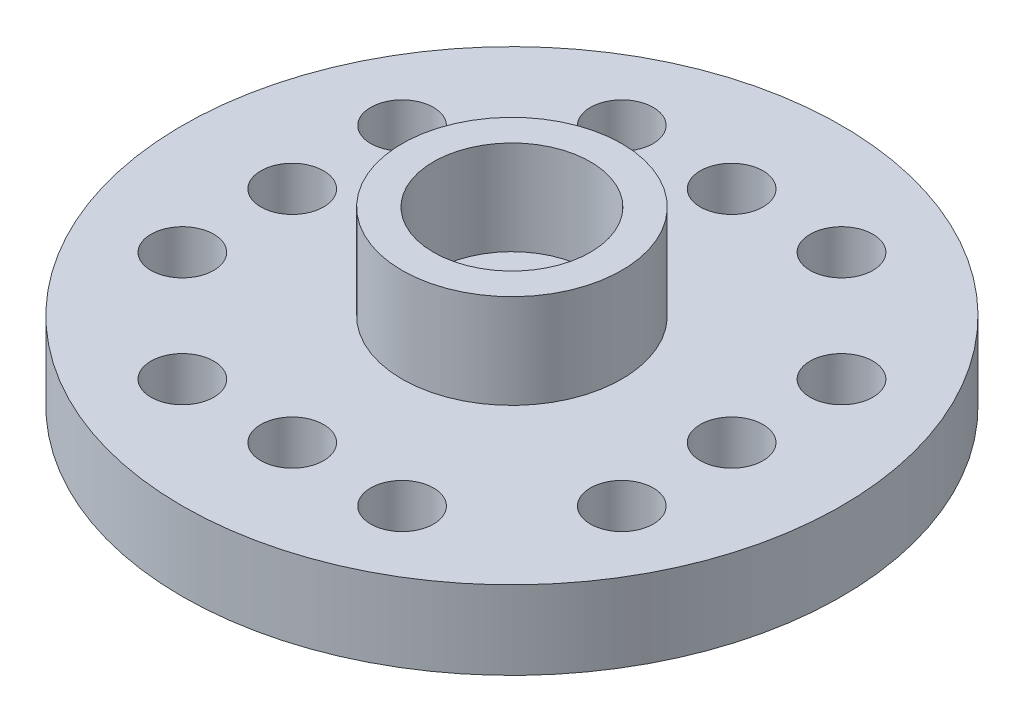
ISO-10303-21;
HEADER;
FILE_DESCRIPTION(('STEP AP214'),'2;1');
FILE_NAME('part.step','',(''),(''),'','','');
FILE_SCHEMA(('AUTOMOTIVE_DESIGN { 1 0 10303 214 1 1 1 1 }'));
ENDSEC;
DATA;
#1=APPLICATION_CONTEXT('core data for automotive mechanical design processes');
#2=APPLICATION_PROTOCOL_DEFINITION('international standard','automotive_design',2000,#1);
#3=PRODUCT_CONTEXT('',#1,'mechanical');
#4=PRODUCT('Part','Part','',(#3));
#5=PRODUCT_RELATED_PRODUCT_CATEGORY('part','',(#4));
#6=PRODUCT_DEFINITION_FORMATION('','',#4);
#7=PRODUCT_DEFINITION_CONTEXT('part definition',#1,'design');
#8=PRODUCT_DEFINITION('design','',#6,#7);
#9=PRODUCT_DEFINITION_SHAPE('','',#8);
#10=(LENGTH_UNIT() NAMED_UNIT(*) SI_UNIT(.MILLI.,.METRE.));
#11=(NAMED_UNIT(*) PLANE_ANGLE_UNIT() SI_UNIT($,.RADIAN.));
#12=(NAMED_UNIT(*) SI_UNIT($,.STERADIAN.) SOLID_ANGLE_UNIT());
#13=UNCERTAINTY_MEASURE_WITH_UNIT(LENGTH_MEASURE(1.E-05),#10,'distance_accuracy_value','');
#14=(GEOMETRIC_REPRESENTATION_CONTEXT(3) GLOBAL_UNCERTAINTY_ASSIGNED_CONTEXT((#13)) GLOBAL_UNIT_ASSIGNED_CONTEXT((#10,
#11,#12)) REPRESENTATION_CONTEXT('',''));
#15=CARTESIAN_POINT('',(0.,0.,0.));
#16=DIRECTION('',(0.,0.,1.));
#17=DIRECTION('',(1.,0.,0.));
#18=AXIS2_PLACEMENT_3D('',#15,#16,#17);
#19=CARTESIAN_POINT('',(0.,-0.5,0.));
#20=DIRECTION('',(0.,1.,0.));
#21=DIRECTION('',(0.,0.,1.));
#22=AXIS2_PLACEMENT_3D('',#19,#20,#21);
#23=CYLINDRICAL_SURFACE('',#22,1.5);
#24=CARTESIAN_POINT('',(0.,2.5,0.));
#25=DIRECTION('',(0.,1.,0.));
#26=DIRECTION('',(0.,0.,1.));
#27=AXIS2_PLACEMENT_3D('',#24,#25,#26);
#28=CIRCLE('',#27,1.5);
#29=CARTESIAN_POINT('',(0.,2.5,1.5));
#30=VERTEX_POINT('',#29);
#31=EDGE_CURVE('E57',#30,#30,#28,.T.);
#32=ORIENTED_EDGE('',*,*,#31,.T.);
#33=EDGE_LOOP('',(#32));
#34=FACE_BOUND('',#33,.T.);
#35=CARTESIAN_POINT('',(0.,1.5,0.));
#36=DIRECTION('',(0.,-1.,0.));
#37=DIRECTION('',(0.,0.,-1.));
#38=AXIS2_PLACEMENT_3D('',#35,#36,#37);
#39=CIRCLE('',#38,1.5);
#40=CARTESIAN_POINT('',(0.,1.5,-1.5));
#41=VERTEX_POINT('',#40);
#42=EDGE_CURVE('E64',#41,#41,#39,.T.);
#43=ORIENTED_EDGE('',*,*,#42,.T.);
#44=EDGE_LOOP('',(#43));
#45=FACE_BOUND('',#44,.T.);
#46=ADVANCED_FACE('F31',(#34,#45),#23,.F.);
#47=CARTESIAN_POINT('',(0.,2.5,0.));
#48=DIRECTION('',(0.,-1.,0.));
#49=DIRECTION('',(0.,0.,-1.));
#50=AXIS2_PLACEMENT_3D('',#47,#48,#49);
#51=CYLINDRICAL_SURFACE('',#50,10.5);
#52=CARTESIAN_POINT('',(0.,2.5,0.));
#53=DIRECTION('',(0.,1.,0.));
#54=DIRECTION('',(0.,0.,1.));
#55=AXIS2_PLACEMENT_3D('',#52,#53,#54);
#56=CIRCLE('',#55,10.5);
#57=CARTESIAN_POINT('',(0.,2.5,10.5));
#58=VERTEX_POINT('',#57);
#59=EDGE_CURVE('E38',#58,#58,#56,.T.);
#60=ORIENTED_EDGE('',*,*,#59,.F.);
#61=EDGE_LOOP('',(#60));
#62=FACE_BOUND('',#61,.T.);
#63=CARTESIAN_POINT('',(0.,0.,0.));
#64=DIRECTION('',(0.,1.,0.));
#65=DIRECTION('',(0.,0.,1.));
#66=AXIS2_PLACEMENT_3D('',#63,#64,#65);
#67=CIRCLE('',#66,10.5);
#68=CARTESIAN_POINT('',(0.,0.,10.5));
#69=VERTEX_POINT('',#68);
#70=EDGE_CURVE('E42',#69,#69,#67,.T.);
#71=ORIENTED_EDGE('',*,*,#70,.T.);
#72=EDGE_LOOP('',(#71));
#73=FACE_BOUND('',#72,.T.);
#74=ADVANCED_FACE('F33',(#62,#73),#51,.T.);
#75=CARTESIAN_POINT('',(0.,2.5,0.));
#76=DIRECTION('',(0.,1.,0.));
#77=DIRECTION('',(0.,0.,1.));
#78=AXIS2_PLACEMENT_3D('',#75,#76,#77);
#79=PLANE('',#78);
#80=CARTESIAN_POINT('',(-6.99999999999931,2.5,-3.5000000000005));
#81=DIRECTION('',(0.,1.,0.));
#82=DIRECTION('',(0.,0.,1.));
#83=AXIS2_PLACEMENT_3D('',#80,#81,#82);
#84=CIRCLE('',#83,1.00000000000076);
#85=CARTESIAN_POINT('',(-6.99999999999931,2.5,-2.49999999999974));
#86=VERTEX_POINT('',#85);
#87=EDGE_CURVE('E69',#86,#86,#84,.T.);
#88=ORIENTED_EDGE('',*,*,#87,.F.);
#89=EDGE_LOOP('',(#88));
#90=FACE_BOUND('',#89,.T.);
#91=CARTESIAN_POINT('',(-6.99999999999931,2.5,3.4999999999995));
#92=DIRECTION('',(0.,1.,0.));
#93=DIRECTION('',(0.,0.,1.));
#94=AXIS2_PLACEMENT_3D('',#91,#92,#93);
#95=CIRCLE('',#94,1.00000000000074);
#96=CARTESIAN_POINT('',(-6.99999999999931,2.5,4.50000000000024));
#97=VERTEX_POINT('',#96);
#98=EDGE_CURVE('E72',#97,#97,#95,.T.);
#99=ORIENTED_EDGE('',*,*,#98,.F.);
#100=EDGE_LOOP('',(#99));
#101=FACE_BOUND('',#100,.T.);
#102=CARTESIAN_POINT('',(-6.99999999999931,2.5,-4.99711383383775E-13));
#103=DIRECTION('',(0.,1.,0.));
#104=DIRECTION('',(0.,0.,1.));
#105=AXIS2_PLACEMENT_3D('',#102,#103,#104);
#106=CIRCLE('',#105,1.00000000000075);
#107=CARTESIAN_POINT('',(-6.99999999999931,2.5,1.00000000000025));
#108=VERTEX_POINT('',#107);
#109=EDGE_CURVE('E75',#108,#108,#106,.T.);
#110=ORIENTED_EDGE('',*,*,#109,.F.);
#111=EDGE_LOOP('',(#110));
#112=FACE_BOUND('',#111,.T.);
#113=CARTESIAN_POINT('',(3.5,2.5,7.));
#114=DIRECTION('',(0.,1.,0.));
#115=DIRECTION('',(0.,0.,1.));
#116=AXIS2_PLACEMENT_3D('',#113,#114,#115);
#117=CIRCLE('',#116,0.999999999999999);
#118=CARTESIAN_POINT('',(3.5,2.5,8.));
#119=VERTEX_POINT('',#118);
#120=EDGE_CURVE('E78',#119,#119,#117,.T.);
#121=ORIENTED_EDGE('',*,*,#120,.F.);
#122=EDGE_LOOP('',(#121));
#123=FACE_BOUND('',#122,.T.);
#124=CARTESIAN_POINT('',(-3.5,2.5,7.));
#125=DIRECTION('',(0.,1.,0.));
#126=DIRECTION('',(0.,0.,1.));
#127=AXIS2_PLACEMENT_3D('',#124,#125,#126);
#128=CIRCLE('',#127,1.);
#129=CARTESIAN_POINT('',(-3.5,2.5,8.));
#130=VERTEX_POINT('',#129);
#131=EDGE_CURVE('E81',#130,#130,#128,.T.);
#132=ORIENTED_EDGE('',*,*,#131,.F.);
#133=EDGE_LOOP('',(#132));
#134=FACE_BOUND('',#133,.T.);
#135=CARTESIAN_POINT('',(7.0000000000005,2.5,6.93143159933774E-13));
#136=DIRECTION('',(0.,1.,0.));
#137=DIRECTION('',(0.,0.,1.));
#138=AXIS2_PLACEMENT_3D('',#135,#136,#137);
#139=CIRCLE('',#138,1.00000000000054);
#140=CARTESIAN_POINT('',(7.0000000000005,2.5,1.00000000000124));
#141=VERTEX_POINT('',#140);
#142=EDGE_CURVE('E84',#141,#141,#139,.T.);
#143=ORIENTED_EDGE('',*,*,#142,.F.);
#144=EDGE_LOOP('',(#143));
#145=FACE_BOUND('',#144,.T.);
#146=CARTESIAN_POINT('',(7.0000000000005,2.5,-3.49999999999931));
#147=DIRECTION('',(0.,1.,0.));
#148=DIRECTION('',(0.,0.,1.));
#149=AXIS2_PLACEMENT_3D('',#146,#147,#148);
#150=CIRCLE('',#149,1.00000000000054);
#151=CARTESIAN_POINT('',(7.0000000000005,2.5,-2.49999999999877));
#152=VERTEX_POINT('',#151);
#153=EDGE_CURVE('E87',#152,#152,#150,.T.);
#154=ORIENTED_EDGE('',*,*,#153,.F.);
#155=EDGE_LOOP('',(#154));
#156=FACE_BOUND('',#155,.T.);
#157=CARTESIAN_POINT('',(3.50000000000119,2.5,-6.99999999999981));
#158=DIRECTION('',(0.,1.,0.));
#159=DIRECTION('',(0.,0.,1.));
#160=AXIS2_PLACEMENT_3D('',#157,#158,#159);
#161=CIRCLE('',#160,1.00000000000125);
#162=CARTESIAN_POINT('',(3.50000000000119,2.5,-5.99999999999855));
#163=VERTEX_POINT('',#162);
#164=EDGE_CURVE('E90',#163,#163,#161,.T.);
#165=ORIENTED_EDGE('',*,*,#164,.F.);
#166=EDGE_LOOP('',(#165));
#167=FACE_BOUND('',#166,.T.);
#168=CARTESIAN_POINT('',(-3.49999999999881,2.5,-6.99999999999981));
#169=DIRECTION('',(0.,1.,0.));
#170=DIRECTION('',(0.,0.,1.));
#171=AXIS2_PLACEMENT_3D('',#168,#169,#170);
#172=CIRCLE('',#171,1.00000000000124);
#173=CARTESIAN_POINT('',(-3.49999999999881,2.5,-5.99999999999857));
#174=VERTEX_POINT('',#173);
#175=EDGE_CURVE('E93',#174,#174,#172,.T.);
#176=ORIENTED_EDGE('',*,*,#175,.F.);
#177=EDGE_LOOP('',(#176));
#178=FACE_BOUND('',#177,.T.);
#179=CARTESIAN_POINT('',(1.19199729055815E-12,2.5,-6.99999999999981));
#180=DIRECTION('',(0.,1.,0.));
#181=DIRECTION('',(0.,0.,1.));
#182=AXIS2_PLACEMENT_3D('',#179,#180,#181);
#183=CIRCLE('',#182,1.00000000000125);
#184=CARTESIAN_POINT('',(1.19199729055815E-12,2.5,-5.99999999999856));
#185=VERTEX_POINT('',#184);
#186=EDGE_CURVE('E96',#185,#185,#183,.T.);
#187=ORIENTED_EDGE('',*,*,#186,.F.);
#188=EDGE_LOOP('',(#187));
#189=FACE_BOUND('',#188,.T.);
#190=CARTESIAN_POINT('',(7.0000000000005,2.5,3.50000000000069));
#191=DIRECTION('',(0.,1.,0.));
#192=DIRECTION('',(0.,0.,1.));
#193=AXIS2_PLACEMENT_3D('',#190,#191,#192);
#194=CIRCLE('',#193,1.00000000000054);
#195=CARTESIAN_POINT('',(7.0000000000005,2.5,4.50000000000124));
#196=VERTEX_POINT('',#195);
#197=EDGE_CURVE('E99',#196,#196,#194,.T.);
#198=ORIENTED_EDGE('',*,*,#197,.F.);
#199=EDGE_LOOP('',(#198));
#200=FACE_BOUND('',#199,.T.);
#201=CARTESIAN_POINT('',(0.,2.5,7.));
#202=DIRECTION('',(0.,1.,0.));
#203=DIRECTION('',(0.,0.,1.));
#204=AXIS2_PLACEMENT_3D('',#201,#202,#203);
#205=CIRCLE('',#204,1.);
#206=CARTESIAN_POINT('',(0.,2.5,8.));
#207=VERTEX_POINT('',#206);
#208=EDGE_CURVE('E102',#207,#207,#205,.T.);
#209=ORIENTED_EDGE('',*,*,#208,.F.);
#210=EDGE_LOOP('',(#209));
#211=FACE_BOUND('',#210,.T.);
#212=CARTESIAN_POINT('',(0.,2.5,0.));
#213=DIRECTION('',(0.,1.,0.));
#214=DIRECTION('',(0.,0.,1.));
#215=AXIS2_PLACEMENT_3D('',#212,#213,#214);
#216=CIRCLE('',#215,3.5);
#217=CARTESIAN_POINT('',(0.,2.5,3.5));
#218=VERTEX_POINT('',#217);
#219=EDGE_CURVE('E49',#218,#218,#216,.T.);
#220=ORIENTED_EDGE('',*,*,#219,.F.);
#221=EDGE_LOOP('',(#220));
#222=FACE_BOUND('',#221,.T.);
#223=ORIENTED_EDGE('',*,*,#59,.T.);
#224=EDGE_LOOP('',(#223));
#225=FACE_BOUND('',#224,.T.);
#226=ADVANCED_FACE('F148',(#90,#101,#112,#123,#134,#145,#156,#167,#178,#189,#200,#211,#222,
#225),#79,.T.);
#227=CARTESIAN_POINT('',(0.,0.,0.));
#228=DIRECTION('',(0.,1.,0.));
#229=DIRECTION('',(0.,0.,1.));
#230=AXIS2_PLACEMENT_3D('',#227,#228,#229);
#231=PLANE('',#230);
#232=CARTESIAN_POINT('',(-6.99999999999931,0.,-3.5000000000005));
#233=DIRECTION('',(0.,-1.,0.));
#234=DIRECTION('',(0.,0.,-1.));
#235=AXIS2_PLACEMENT_3D('',#232,#233,#234);
#236=CIRCLE('',#235,1.00000000000076);
#237=CARTESIAN_POINT('',(-6.99999999999931,0.,-4.50000000000126));
#238=VERTEX_POINT('',#237);
#239=EDGE_CURVE('E109',#238,#238,#236,.T.);
#240=ORIENTED_EDGE('',*,*,#239,.F.);
#241=EDGE_LOOP('',(#240));
#242=FACE_BOUND('',#241,.T.);
#243=CARTESIAN_POINT('',(-6.99999999999931,0.,3.4999999999995));
#244=DIRECTION('',(0.,-1.,0.));
#245=DIRECTION('',(0.,0.,-1.));
#246=AXIS2_PLACEMENT_3D('',#243,#244,#245);
#247=CIRCLE('',#246,1.00000000000074);
#248=CARTESIAN_POINT('',(-6.99999999999931,0.,2.49999999999876));
#249=VERTEX_POINT('',#248);
#250=EDGE_CURVE('E112',#249,#249,#247,.T.);
#251=ORIENTED_EDGE('',*,*,#250,.F.);
#252=EDGE_LOOP('',(#251));
#253=FACE_BOUND('',#252,.T.);
#254=CARTESIAN_POINT('',(-6.99999999999931,0.,-4.99711383383775E-13));
#255=DIRECTION('',(0.,-1.,0.));
#256=DIRECTION('',(0.,0.,-1.));
#257=AXIS2_PLACEMENT_3D('',#254,#255,#256);
#258=CIRCLE('',#257,1.00000000000075);
#259=CARTESIAN_POINT('',(-6.99999999999931,0.,-1.00000000000125));
#260=VERTEX_POINT('',#259);
#261=EDGE_CURVE('E115',#260,#260,#258,.T.);
#262=ORIENTED_EDGE('',*,*,#261,.F.);
#263=EDGE_LOOP('',(#262));
#264=FACE_BOUND('',#263,.T.);
#265=CARTESIAN_POINT('',(3.5,0.,7.));
#266=DIRECTION('',(0.,-1.,0.));
#267=DIRECTION('',(0.,0.,-1.));
#268=AXIS2_PLACEMENT_3D('',#265,#266,#267);
#269=CIRCLE('',#268,0.999999999999999);
#270=CARTESIAN_POINT('',(3.5,0.,6.));
#271=VERTEX_POINT('',#270);
#272=EDGE_CURVE('E108',#271,#271,#269,.T.);
#273=ORIENTED_EDGE('',*,*,#272,.F.);
#274=EDGE_LOOP('',(#273));
#275=FACE_BOUND('',#274,.T.);
#276=CARTESIAN_POINT('',(-3.5,0.,7.));
#277=DIRECTION('',(0.,-1.,0.));
#278=DIRECTION('',(0.,0.,-1.));
#279=AXIS2_PLACEMENT_3D('',#276,#277,#278);
#280=CIRCLE('',#279,1.);
#281=CARTESIAN_POINT('',(-3.5,0.,6.));
#282=VERTEX_POINT('',#281);
#283=EDGE_CURVE('E126',#282,#282,#280,.T.);
#284=ORIENTED_EDGE('',*,*,#283,.F.);
#285=EDGE_LOOP('',(#284));
#286=FACE_BOUND('',#285,.T.);
#287=CARTESIAN_POINT('',(7.0000000000005,0.,6.93143159933774E-13));
#288=DIRECTION('',(0.,-1.,0.));
#289=DIRECTION('',(0.,0.,-1.));
#290=AXIS2_PLACEMENT_3D('',#287,#288,#289);
#291=CIRCLE('',#290,1.00000000000054);
#292=CARTESIAN_POINT('',(7.0000000000005,0.,-0.999999999999849));
#293=VERTEX_POINT('',#292);
#294=EDGE_CURVE('E122',#293,#293,#291,.T.);
#295=ORIENTED_EDGE('',*,*,#294,.F.);
#296=EDGE_LOOP('',(#295));
#297=FACE_BOUND('',#296,.T.);
#298=CARTESIAN_POINT('',(7.0000000000005,0.,-3.49999999999931));
#299=DIRECTION('',(0.,-1.,0.));
#300=DIRECTION('',(0.,0.,-1.));
#301=AXIS2_PLACEMENT_3D('',#298,#299,#300);
#302=CIRCLE('',#301,1.00000000000054);
#303=CARTESIAN_POINT('',(7.0000000000005,0.,-4.49999999999984));
#304=VERTEX_POINT('',#303);
#305=EDGE_CURVE('E119',#304,#304,#302,.T.);
#306=ORIENTED_EDGE('',*,*,#305,.F.);
#307=EDGE_LOOP('',(#306));
#308=FACE_BOUND('',#307,.T.);
#309=CARTESIAN_POINT('',(3.50000000000119,0.,-6.99999999999981));
#310=DIRECTION('',(0.,-1.,0.));
#311=DIRECTION('',(0.,0.,-1.));
#312=AXIS2_PLACEMENT_3D('',#309,#310,#311);
#313=CIRCLE('',#312,1.00000000000125);
#314=CARTESIAN_POINT('',(3.50000000000119,0.,-8.00000000000106));
#315=VERTEX_POINT('',#314);
#316=EDGE_CURVE('E118',#315,#315,#313,.T.);
#317=ORIENTED_EDGE('',*,*,#316,.F.);
#318=EDGE_LOOP('',(#317));
#319=FACE_BOUND('',#318,.T.);
#320=CARTESIAN_POINT('',(-3.49999999999881,0.,-6.99999999999981));
#321=DIRECTION('',(0.,-1.,0.));
#322=DIRECTION('',(0.,0.,-1.));
#323=AXIS2_PLACEMENT_3D('',#320,#321,#322);
#324=CIRCLE('',#323,1.00000000000124);
#325=CARTESIAN_POINT('',(-3.49999999999881,0.,-8.00000000000104));
#326=VERTEX_POINT('',#325);
#327=EDGE_CURVE('E134',#326,#326,#324,.T.);
#328=ORIENTED_EDGE('',*,*,#327,.F.);
#329=EDGE_LOOP('',(#328));
#330=FACE_BOUND('',#329,.T.);
#331=CARTESIAN_POINT('',(1.19199729055815E-12,0.,-6.99999999999981));
#332=DIRECTION('',(0.,-1.,0.));
#333=DIRECTION('',(0.,0.,-1.));
#334=AXIS2_PLACEMENT_3D('',#331,#332,#333);
#335=CIRCLE('',#334,1.00000000000125);
#336=CARTESIAN_POINT('',(1.19199729055815E-12,0.,-8.00000000000105));
#337=VERTEX_POINT('',#336);
#338=EDGE_CURVE('E131',#337,#337,#335,.T.);
#339=ORIENTED_EDGE('',*,*,#338,.F.);
#340=EDGE_LOOP('',(#339));
#341=FACE_BOUND('',#340,.T.);
#342=CARTESIAN_POINT('',(7.0000000000005,0.,3.50000000000069));
#343=DIRECTION('',(0.,-1.,0.));
#344=DIRECTION('',(0.,0.,-1.));
#345=AXIS2_PLACEMENT_3D('',#342,#343,#344);
#346=CIRCLE('',#345,1.00000000000054);
#347=CARTESIAN_POINT('',(7.0000000000005,0.,2.50000000000015));
#348=VERTEX_POINT('',#347);
#349=EDGE_CURVE('E123',#348,#348,#346,.T.);
#350=ORIENTED_EDGE('',*,*,#349,.F.);
#351=EDGE_LOOP('',(#350));
#352=FACE_BOUND('',#351,.T.);
#353=CARTESIAN_POINT('',(0.,0.,7.));
#354=DIRECTION('',(0.,-1.,0.));
#355=DIRECTION('',(0.,0.,-1.));
#356=AXIS2_PLACEMENT_3D('',#353,#354,#355);
#357=CIRCLE('',#356,1.);
#358=CARTESIAN_POINT('',(0.,0.,6.));
#359=VERTEX_POINT('',#358);
#360=EDGE_CURVE('E105',#359,#359,#357,.T.);
#361=ORIENTED_EDGE('',*,*,#360,.F.);
#362=EDGE_LOOP('',(#361));
#363=FACE_BOUND('',#362,.T.);
#364=CARTESIAN_POINT('',(0.,0.,0.));
#365=DIRECTION('',(0.,-1.,0.));
#366=DIRECTION('',(0.,0.,-1.));
#367=AXIS2_PLACEMENT_3D('',#364,#365,#366);
#368=CIRCLE('',#367,4.5);
#369=CARTESIAN_POINT('',(0.,0.,-4.5));
#370=VERTEX_POINT('',#369);
#371=EDGE_CURVE('E61',#370,#370,#368,.T.);
#372=ORIENTED_EDGE('',*,*,#371,.F.);
#373=EDGE_LOOP('',(#372));
#374=FACE_BOUND('',#373,.T.);
#375=ORIENTED_EDGE('',*,*,#70,.F.);
#376=EDGE_LOOP('',(#375));
#377=FACE_BOUND('',#376,.T.);
#378=ADVANCED_FACE('F144',(#242,#253,#264,#275,#286,#297,#308,#319,#330,#341,#352,#363,#374,
#377),#231,.F.);
#379=CARTESIAN_POINT('',(0.,5.5,0.));
#380=DIRECTION('',(0.,1.,0.));
#381=DIRECTION('',(0.,0.,1.));
#382=AXIS2_PLACEMENT_3D('',#379,#380,#381);
#383=PLANE('',#382);
#384=CARTESIAN_POINT('',(0.,5.5,0.));
#385=DIRECTION('',(0.,1.,0.));
#386=DIRECTION('',(0.,0.,1.));
#387=AXIS2_PLACEMENT_3D('',#384,#385,#386);
#388=CIRCLE('',#387,3.5);
#389=CARTESIAN_POINT('',(0.,5.5,3.5));
#390=VERTEX_POINT('',#389);
#391=EDGE_CURVE('E47',#390,#390,#388,.T.);
#392=ORIENTED_EDGE('',*,*,#391,.T.);
#393=EDGE_LOOP('',(#392));
#394=FACE_BOUND('',#393,.T.);
#395=CARTESIAN_POINT('',(0.,5.5,0.));
#396=DIRECTION('',(0.,1.,0.));
#397=DIRECTION('',(0.,0.,1.));
#398=AXIS2_PLACEMENT_3D('',#395,#396,#397);
#399=CIRCLE('',#398,2.5);
#400=CARTESIAN_POINT('',(0.,5.5,2.5));
#401=VERTEX_POINT('',#400);
#402=EDGE_CURVE('E52',#401,#401,#399,.T.);
#403=ORIENTED_EDGE('',*,*,#402,.F.);
#404=EDGE_LOOP('',(#403));
#405=FACE_BOUND('',#404,.T.);
#406=ADVANCED_FACE('F147',(#394,#405),#383,.T.);
#407=CARTESIAN_POINT('',(0.,5.5,0.));
#408=DIRECTION('',(0.,-1.,0.));
#409=DIRECTION('',(0.,0.,-1.));
#410=AXIS2_PLACEMENT_3D('',#407,#408,#409);
#411=CYLINDRICAL_SURFACE('',#410,3.5);
#412=ORIENTED_EDGE('',*,*,#391,.F.);
#413=EDGE_LOOP('',(#412));
#414=FACE_BOUND('',#413,.T.);
#415=ORIENTED_EDGE('',*,*,#219,.T.);
#416=EDGE_LOOP('',(#415));
#417=FACE_BOUND('',#416,.T.);
#418=ADVANCED_FACE('F181',(#414,#417),#411,.T.);
#419=CARTESIAN_POINT('',(0.,5.5,0.));
#420=DIRECTION('',(0.,-1.,0.));
#421=DIRECTION('',(0.,0.,-1.));
#422=AXIS2_PLACEMENT_3D('',#419,#420,#421);
#423=CYLINDRICAL_SURFACE('',#422,2.5);
#424=ORIENTED_EDGE('',*,*,#402,.T.);
#425=EDGE_LOOP('',(#424));
#426=FACE_BOUND('',#425,.T.);
#427=CARTESIAN_POINT('',(0.,2.5,0.));
#428=DIRECTION('',(0.,1.,0.));
#429=DIRECTION('',(0.,0.,1.));
#430=AXIS2_PLACEMENT_3D('',#427,#428,#429);
#431=CIRCLE('',#430,2.5);
#432=CARTESIAN_POINT('',(0.,2.5,2.5));
#433=VERTEX_POINT('',#432);
#434=EDGE_CURVE('E10',#433,#433,#431,.F.);
#435=ORIENTED_EDGE('',*,*,#434,.T.);
#436=EDGE_LOOP('',(#435));
#437=FACE_BOUND('',#436,.T.);
#438=ADVANCED_FACE('F178',(#426,#437),#423,.F.);
#439=ORIENTED_EDGE('',*,*,#31,.F.);
#440=EDGE_LOOP('',(#439));
#441=FACE_BOUND('',#440,.T.);
#442=ORIENTED_EDGE('',*,*,#434,.F.);
#443=EDGE_LOOP('',(#442));
#444=FACE_BOUND('',#443,.T.);
#445=ADVANCED_FACE('F168',(#441,#444),#79,.T.);
#446=CARTESIAN_POINT('',(0.,1.5,0.));
#447=DIRECTION('',(0.,-1.,0.));
#448=DIRECTION('',(0.,0.,-1.));
#449=AXIS2_PLACEMENT_3D('',#446,#447,#448);
#450=CYLINDRICAL_SURFACE('',#449,4.5);
#451=CARTESIAN_POINT('',(0.,1.5,0.));
#452=DIRECTION('',(0.,-1.,0.));
#453=DIRECTION('',(0.,0.,-1.));
#454=AXIS2_PLACEMENT_3D('',#451,#452,#453);
#455=CIRCLE('',#454,4.5);
#456=CARTESIAN_POINT('',(0.,1.5,-4.5));
#457=VERTEX_POINT('',#456);
#458=EDGE_CURVE('E60',#457,#457,#455,.T.);
#459=ORIENTED_EDGE('',*,*,#458,.F.);
#460=EDGE_LOOP('',(#459));
#461=FACE_BOUND('',#460,.T.);
#462=ORIENTED_EDGE('',*,*,#371,.T.);
#463=EDGE_LOOP('',(#462));
#464=FACE_BOUND('',#463,.T.);
#465=ADVANCED_FACE('F176',(#461,#464),#450,.F.);
#466=CARTESIAN_POINT('',(0.,1.5,0.));
#467=DIRECTION('',(0.,-1.,0.));
#468=DIRECTION('',(0.,0.,-1.));
#469=AXIS2_PLACEMENT_3D('',#466,#467,#468);
#470=PLANE('',#469);
#471=ORIENTED_EDGE('',*,*,#42,.F.);
#472=EDGE_LOOP('',(#471));
#473=FACE_BOUND('',#472,.T.);
#474=ORIENTED_EDGE('',*,*,#458,.T.);
#475=EDGE_LOOP('',(#474));
#476=FACE_BOUND('',#475,.T.);
#477=ADVANCED_FACE('F214',(#473,#476),#470,.T.);
#478=CARTESIAN_POINT('',(0.,3.,7.));
#479=DIRECTION('',(0.,-1.,0.));
#480=DIRECTION('',(0.,0.,-1.));
#481=AXIS2_PLACEMENT_3D('',#478,#479,#480);
#482=CYLINDRICAL_SURFACE('',#481,1.);
#483=ORIENTED_EDGE('',*,*,#208,.T.);
#484=EDGE_LOOP('',(#483));
#485=FACE_BOUND('',#484,.T.);
#486=ORIENTED_EDGE('',*,*,#360,.T.);
#487=EDGE_LOOP('',(#486));
#488=FACE_BOUND('',#487,.T.);
#489=ADVANCED_FACE('F221',(#485,#488),#482,.F.);
#490=CARTESIAN_POINT('',(7.0000000000005,3.,3.50000000000069));
#491=DIRECTION('',(0.,-1.,0.));
#492=DIRECTION('',(0.,0.,-1.));
#493=AXIS2_PLACEMENT_3D('',#490,#491,#492);
#494=CYLINDRICAL_SURFACE('',#493,1.00000000000054);
#495=ORIENTED_EDGE('',*,*,#197,.T.);
#496=EDGE_LOOP('',(#495));
#497=FACE_BOUND('',#496,.T.);
#498=ORIENTED_EDGE('',*,*,#349,.T.);
#499=EDGE_LOOP('',(#498));
#500=FACE_BOUND('',#499,.T.);
#501=ADVANCED_FACE('F229',(#497,#500),#494,.F.);
#502=CARTESIAN_POINT('',(1.19199729055815E-12,3.,-6.99999999999981));
#503=DIRECTION('',(0.,-1.,0.));
#504=DIRECTION('',(0.,0.,-1.));
#505=AXIS2_PLACEMENT_3D('',#502,#503,#504);
#506=CYLINDRICAL_SURFACE('',#505,1.00000000000125);
#507=ORIENTED_EDGE('',*,*,#186,.T.);
#508=EDGE_LOOP('',(#507));
#509=FACE_BOUND('',#508,.T.);
#510=ORIENTED_EDGE('',*,*,#338,.T.);
#511=EDGE_LOOP('',(#510));
#512=FACE_BOUND('',#511,.T.);
#513=ADVANCED_FACE('F238',(#509,#512),#506,.F.);
#514=CARTESIAN_POINT('',(-3.49999999999881,3.,-6.99999999999981));
#515=DIRECTION('',(0.,-1.,0.));
#516=DIRECTION('',(0.,0.,-1.));
#517=AXIS2_PLACEMENT_3D('',#514,#515,#516);
#518=CYLINDRICAL_SURFACE('',#517,1.00000000000124);
#519=ORIENTED_EDGE('',*,*,#175,.T.);
#520=EDGE_LOOP('',(#519));
#521=FACE_BOUND('',#520,.T.);
#522=ORIENTED_EDGE('',*,*,#327,.T.);
#523=EDGE_LOOP('',(#522));
#524=FACE_BOUND('',#523,.T.);
#525=ADVANCED_FACE('F142',(#521,#524),#518,.F.);
#526=CARTESIAN_POINT('',(3.50000000000119,3.,-6.99999999999981));
#527=DIRECTION('',(0.,-1.,0.));
#528=DIRECTION('',(0.,0.,-1.));
#529=AXIS2_PLACEMENT_3D('',#526,#527,#528);
#530=CYLINDRICAL_SURFACE('',#529,1.00000000000125);
#531=ORIENTED_EDGE('',*,*,#164,.T.);
#532=EDGE_LOOP('',(#531));
#533=FACE_BOUND('',#532,.T.);
#534=ORIENTED_EDGE('',*,*,#316,.T.);
#535=EDGE_LOOP('',(#534));
#536=FACE_BOUND('',#535,.T.);
#537=ADVANCED_FACE('F253',(#533,#536),#530,.F.);
#538=CARTESIAN_POINT('',(7.0000000000005,3.,-3.49999999999931));
#539=DIRECTION('',(0.,-1.,0.));
#540=DIRECTION('',(0.,0.,-1.));
#541=AXIS2_PLACEMENT_3D('',#538,#539,#540);
#542=CYLINDRICAL_SURFACE('',#541,1.00000000000054);
#543=ORIENTED_EDGE('',*,*,#153,.T.);
#544=EDGE_LOOP('',(#543));
#545=FACE_BOUND('',#544,.T.);
#546=ORIENTED_EDGE('',*,*,#305,.T.);
#547=EDGE_LOOP('',(#546));
#548=FACE_BOUND('',#547,.T.);
#549=ADVANCED_FACE('F261',(#545,#548),#542,.F.);
#550=CARTESIAN_POINT('',(7.0000000000005,3.,6.93143159933774E-13));
#551=DIRECTION('',(0.,-1.,0.));
#552=DIRECTION('',(0.,0.,-1.));
#553=AXIS2_PLACEMENT_3D('',#550,#551,#552);
#554=CYLINDRICAL_SURFACE('',#553,1.00000000000054);
#555=ORIENTED_EDGE('',*,*,#142,.T.);
#556=EDGE_LOOP('',(#555));
#557=FACE_BOUND('',#556,.T.);
#558=ORIENTED_EDGE('',*,*,#294,.T.);
#559=EDGE_LOOP('',(#558));
#560=FACE_BOUND('',#559,.T.);
#561=ADVANCED_FACE('F269',(#557,#560),#554,.F.);
#562=CARTESIAN_POINT('',(-3.5,3.,7.));
#563=DIRECTION('',(0.,-1.,0.));
#564=DIRECTION('',(0.,0.,-1.));
#565=AXIS2_PLACEMENT_3D('',#562,#563,#564);
#566=CYLINDRICAL_SURFACE('',#565,1.);
#567=ORIENTED_EDGE('',*,*,#131,.T.);
#568=EDGE_LOOP('',(#567));
#569=FACE_BOUND('',#568,.T.);
#570=ORIENTED_EDGE('',*,*,#283,.T.);
#571=EDGE_LOOP('',(#570));
#572=FACE_BOUND('',#571,.T.);
#573=ADVANCED_FACE('F277',(#569,#572),#566,.F.);
#574=CARTESIAN_POINT('',(3.5,3.,7.));
#575=DIRECTION('',(0.,-1.,0.));
#576=DIRECTION('',(0.,0.,-1.));
#577=AXIS2_PLACEMENT_3D('',#574,#575,#576);
#578=CYLINDRICAL_SURFACE('',#577,0.999999999999999);
#579=ORIENTED_EDGE('',*,*,#120,.T.);
#580=EDGE_LOOP('',(#579));
#581=FACE_BOUND('',#580,.T.);
#582=ORIENTED_EDGE('',*,*,#272,.T.);
#583=EDGE_LOOP('',(#582));
#584=FACE_BOUND('',#583,.T.);
#585=ADVANCED_FACE('F285',(#581,#584),#578,.F.);
#586=CARTESIAN_POINT('',(-6.99999999999931,3.,-4.99711383383775E-13));
#587=DIRECTION('',(0.,-1.,0.));
#588=DIRECTION('',(0.,0.,-1.));
#589=AXIS2_PLACEMENT_3D('',#586,#587,#588);
#590=CYLINDRICAL_SURFACE('',#589,1.00000000000075);
#591=ORIENTED_EDGE('',*,*,#109,.T.);
#592=EDGE_LOOP('',(#591));
#593=FACE_BOUND('',#592,.T.);
#594=ORIENTED_EDGE('',*,*,#261,.T.);
#595=EDGE_LOOP('',(#594));
#596=FACE_BOUND('',#595,.T.);
#597=ADVANCED_FACE('F293',(#593,#596),#590,.F.);
#598=CARTESIAN_POINT('',(-6.99999999999931,3.,3.4999999999995));
#599=DIRECTION('',(0.,-1.,0.));
#600=DIRECTION('',(0.,0.,-1.));
#601=AXIS2_PLACEMENT_3D('',#598,#599,#600);
#602=CYLINDRICAL_SURFACE('',#601,1.00000000000074);
#603=ORIENTED_EDGE('',*,*,#98,.T.);
#604=EDGE_LOOP('',(#603));
#605=FACE_BOUND('',#604,.T.);
#606=ORIENTED_EDGE('',*,*,#250,.T.);
#607=EDGE_LOOP('',(#606));
#608=FACE_BOUND('',#607,.T.);
#609=ADVANCED_FACE('F301',(#605,#608),#602,.F.);
#610=CARTESIAN_POINT('',(-6.99999999999931,3.,-3.5000000000005));
#611=DIRECTION('',(0.,-1.,0.));
#612=DIRECTION('',(0.,0.,-1.));
#613=AXIS2_PLACEMENT_3D('',#610,#611,#612);
#614=CYLINDRICAL_SURFACE('',#613,1.00000000000076);
#615=ORIENTED_EDGE('',*,*,#87,.T.);
#616=EDGE_LOOP('',(#615));
#617=FACE_BOUND('',#616,.T.);
#618=ORIENTED_EDGE('',*,*,#239,.T.);
#619=EDGE_LOOP('',(#618));
#620=FACE_BOUND('',#619,.T.);
#621=ADVANCED_FACE('F309',(#617,#620),#614,.F.);
#622=CLOSED_SHELL('',(#46,#74,#226,#378,#406,#418,#438,#445,#465,#477,#489,#501,#513,#525,#537,
#549,#561,#573,#585,#597,#609,#621));
#623=MANIFOLD_SOLID_BREP('B2',#622);
#624=ADVANCED_BREP_SHAPE_REPRESENTATION('',(#18,#623),#14);
#625=SHAPE_DEFINITION_REPRESENTATION(#9,#624);
ENDSEC;
END-ISO-10303-21;
